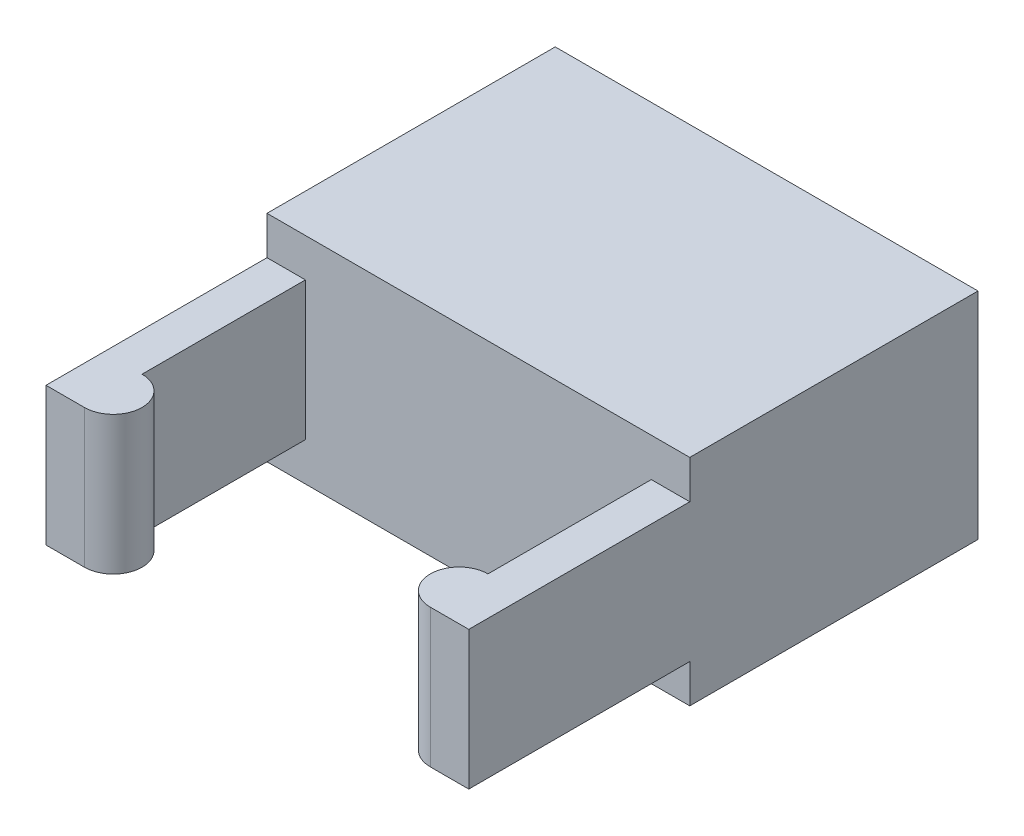
ISO-10303-21;
HEADER;
FILE_DESCRIPTION(('STEP AP214'),'2;1');
FILE_NAME('part.step','',(''),(''),'','','');
FILE_SCHEMA(('AUTOMOTIVE_DESIGN { 1 0 10303 214 1 1 1 1 }'));
ENDSEC;
DATA;
#1=APPLICATION_CONTEXT('core data for automotive mechanical design processes');
#2=APPLICATION_PROTOCOL_DEFINITION('international standard','automotive_design',2000,#1);
#3=PRODUCT_CONTEXT('',#1,'mechanical');
#4=PRODUCT('Part','Part','',(#3));
#5=PRODUCT_RELATED_PRODUCT_CATEGORY('part','',(#4));
#6=PRODUCT_DEFINITION_FORMATION('','',#4);
#7=PRODUCT_DEFINITION_CONTEXT('part definition',#1,'design');
#8=PRODUCT_DEFINITION('design','',#6,#7);
#9=PRODUCT_DEFINITION_SHAPE('','',#8);
#10=(LENGTH_UNIT() NAMED_UNIT(*) SI_UNIT(.MILLI.,.METRE.));
#11=(NAMED_UNIT(*) PLANE_ANGLE_UNIT() SI_UNIT($,.RADIAN.));
#12=(NAMED_UNIT(*) SI_UNIT($,.STERADIAN.) SOLID_ANGLE_UNIT());
#13=UNCERTAINTY_MEASURE_WITH_UNIT(LENGTH_MEASURE(1.E-05),#10,'distance_accuracy_value','');
#14=(GEOMETRIC_REPRESENTATION_CONTEXT(3) GLOBAL_UNCERTAINTY_ASSIGNED_CONTEXT((#13)) GLOBAL_UNIT_ASSIGNED_CONTEXT((#10,
#11,#12)) REPRESENTATION_CONTEXT('',''));
#15=CARTESIAN_POINT('',(0.,0.,0.));
#16=DIRECTION('',(0.,0.,1.));
#17=DIRECTION('',(1.,0.,0.));
#18=AXIS2_PLACEMENT_3D('',#15,#16,#17);
#19=CARTESIAN_POINT('',(0.,0.,15.));
#20=DIRECTION('',(0.,0.,1.));
#21=DIRECTION('',(1.,0.,0.));
#22=AXIS2_PLACEMENT_3D('',#19,#20,#21);
#23=PLANE('',#22);
#24=DIRECTION('',(1.,0.,0.));
#25=VECTOR('',#24,1.);
#26=CARTESIAN_POINT('',(0.,-3.6,15.));
#27=LINE('',#26,#25);
#28=CARTESIAN_POINT('',(-11.,-3.6,15.));
#29=VERTEX_POINT('',#28);
#30=CARTESIAN_POINT('',(-9.,-3.6,15.));
#31=VERTEX_POINT('',#30);
#32=EDGE_CURVE('E212',#29,#31,#27,.T.);
#33=ORIENTED_EDGE('',*,*,#32,.F.);
#34=DIRECTION('',(0.,1.,0.));
#35=VECTOR('',#34,1.);
#36=CARTESIAN_POINT('',(-11.,0.,15.));
#37=LINE('',#36,#35);
#38=CARTESIAN_POINT('',(-11.,-5.6,15.));
#39=VERTEX_POINT('',#38);
#40=EDGE_CURVE('E272',#39,#29,#37,.T.);
#41=ORIENTED_EDGE('',*,*,#40,.F.);
#42=DIRECTION('',(1.,0.,0.));
#43=VECTOR('',#42,1.);
#44=CARTESIAN_POINT('',(0.,-5.6,15.));
#45=LINE('',#44,#43);
#46=CARTESIAN_POINT('',(11.,-5.6,15.));
#47=VERTEX_POINT('',#46);
#48=EDGE_CURVE('E258',#39,#47,#45,.T.);
#49=ORIENTED_EDGE('',*,*,#48,.T.);
#50=DIRECTION('',(0.,1.,0.));
#51=VECTOR('',#50,1.);
#52=CARTESIAN_POINT('',(11.,0.,15.));
#53=LINE('',#52,#51);
#54=CARTESIAN_POINT('',(11.,-3.6,15.));
#55=VERTEX_POINT('',#54);
#56=EDGE_CURVE('E264',#47,#55,#53,.T.);
#57=ORIENTED_EDGE('',*,*,#56,.T.);
#58=DIRECTION('',(-1.,0.,0.));
#59=VECTOR('',#58,1.);
#60=CARTESIAN_POINT('',(0.,-3.6,15.));
#61=LINE('',#60,#59);
#62=CARTESIAN_POINT('',(9.,-3.6,15.));
#63=VERTEX_POINT('',#62);
#64=EDGE_CURVE('E70',#55,#63,#61,.T.);
#65=ORIENTED_EDGE('',*,*,#64,.T.);
#66=DIRECTION('',(0.,1.,0.));
#67=VECTOR('',#66,1.);
#68=CARTESIAN_POINT('',(9.,0.,15.));
#69=LINE('',#68,#67);
#70=CARTESIAN_POINT('',(9.,3.6,15.));
#71=VERTEX_POINT('',#70);
#72=EDGE_CURVE('E243',#63,#71,#69,.T.);
#73=ORIENTED_EDGE('',*,*,#72,.T.);
#74=DIRECTION('',(-1.,0.,0.));
#75=VECTOR('',#74,1.);
#76=CARTESIAN_POINT('',(0.,3.6,15.));
#77=LINE('',#76,#75);
#78=CARTESIAN_POINT('',(11.,3.6,15.));
#79=VERTEX_POINT('',#78);
#80=EDGE_CURVE('E240',#79,#71,#77,.T.);
#81=ORIENTED_EDGE('',*,*,#80,.F.);
#82=CARTESIAN_POINT('',(11.,5.6,15.));
#83=VERTEX_POINT('',#82);
#84=EDGE_CURVE('E262',#79,#83,#53,.T.);
#85=ORIENTED_EDGE('',*,*,#84,.T.);
#86=DIRECTION('',(1.,0.,0.));
#87=VECTOR('',#86,1.);
#88=CARTESIAN_POINT('',(0.,5.6,15.));
#89=LINE('',#88,#87);
#90=CARTESIAN_POINT('',(-11.,5.6,15.));
#91=VERTEX_POINT('',#90);
#92=EDGE_CURVE('E267',#91,#83,#89,.T.);
#93=ORIENTED_EDGE('',*,*,#92,.F.);
#94=CARTESIAN_POINT('',(-11.,3.6,15.));
#95=VERTEX_POINT('',#94);
#96=EDGE_CURVE('E271',#95,#91,#37,.T.);
#97=ORIENTED_EDGE('',*,*,#96,.F.);
#98=DIRECTION('',(1.,0.,0.));
#99=VECTOR('',#98,1.);
#100=CARTESIAN_POINT('',(0.,3.6,15.));
#101=LINE('',#100,#99);
#102=CARTESIAN_POINT('',(-9.,3.6,15.));
#103=VERTEX_POINT('',#102);
#104=EDGE_CURVE('E211',#95,#103,#101,.T.);
#105=ORIENTED_EDGE('',*,*,#104,.T.);
#106=DIRECTION('',(0.,1.,0.));
#107=VECTOR('',#106,1.);
#108=CARTESIAN_POINT('',(-9.,0.,15.));
#109=LINE('',#108,#107);
#110=EDGE_CURVE('E63',#31,#103,#109,.T.);
#111=ORIENTED_EDGE('',*,*,#110,.F.);
#112=EDGE_LOOP('',(#33,#41,#49,#57,#65,#73,#81,#85,#93,#97,#105,#111));
#113=FACE_BOUND('',#112,.T.);
#114=ADVANCED_FACE('F47',(#113),#23,.T.);
#115=CARTESIAN_POINT('',(0.,-5.6,15.));
#116=DIRECTION('',(0.,1.,0.));
#117=DIRECTION('',(0.,0.,1.));
#118=AXIS2_PLACEMENT_3D('',#115,#116,#117);
#119=PLANE('',#118);
#120=DIRECTION('',(1.,0.,0.));
#121=VECTOR('',#120,1.);
#122=CARTESIAN_POINT('',(0.,-5.6,0.));
#123=LINE('',#122,#121);
#124=CARTESIAN_POINT('',(-11.,-5.6,0.));
#125=VERTEX_POINT('',#124);
#126=CARTESIAN_POINT('',(11.,-5.6,0.));
#127=VERTEX_POINT('',#126);
#128=EDGE_CURVE('E235',#125,#127,#123,.T.);
#129=ORIENTED_EDGE('',*,*,#128,.T.);
#130=DIRECTION('',(0.,0.,-1.));
#131=VECTOR('',#130,1.);
#132=CARTESIAN_POINT('',(11.,-5.6,15.));
#133=LINE('',#132,#131);
#134=EDGE_CURVE('E11',#47,#127,#133,.T.);
#135=ORIENTED_EDGE('',*,*,#134,.F.);
#136=ORIENTED_EDGE('',*,*,#48,.F.);
#137=DIRECTION('',(0.,0.,-1.));
#138=VECTOR('',#137,1.);
#139=CARTESIAN_POINT('',(-11.,-5.6,15.));
#140=LINE('',#139,#138);
#141=EDGE_CURVE('E276',#39,#125,#140,.T.);
#142=ORIENTED_EDGE('',*,*,#141,.T.);
#143=EDGE_LOOP('',(#129,#135,#136,#142));
#144=FACE_BOUND('',#143,.T.);
#145=ADVANCED_FACE('F49',(#144),#119,.F.);
#146=CARTESIAN_POINT('',(11.,0.,15.));
#147=DIRECTION('',(-1.,0.,0.));
#148=DIRECTION('',(0.,0.,1.));
#149=AXIS2_PLACEMENT_3D('',#146,#147,#148);
#150=PLANE('',#149);
#151=DIRECTION('',(0.,1.,0.));
#152=VECTOR('',#151,1.);
#153=CARTESIAN_POINT('',(11.,0.,0.));
#154=LINE('',#153,#152);
#155=CARTESIAN_POINT('',(11.,5.6,0.));
#156=VERTEX_POINT('',#155);
#157=EDGE_CURVE('E280',#127,#156,#154,.T.);
#158=ORIENTED_EDGE('',*,*,#157,.T.);
#159=DIRECTION('',(0.,0.,-1.));
#160=VECTOR('',#159,1.);
#161=CARTESIAN_POINT('',(11.,5.6,15.));
#162=LINE('',#161,#160);
#163=EDGE_CURVE('E56',#83,#156,#162,.T.);
#164=ORIENTED_EDGE('',*,*,#163,.F.);
#165=ORIENTED_EDGE('',*,*,#84,.F.);
#166=DIRECTION('',(0.,0.,-1.));
#167=VECTOR('',#166,1.);
#168=CARTESIAN_POINT('',(11.,3.6,23.5));
#169=LINE('',#168,#167);
#170=CARTESIAN_POINT('',(11.,3.6,26.5));
#171=VERTEX_POINT('',#170);
#172=EDGE_CURVE('E251',#171,#79,#169,.T.);
#173=ORIENTED_EDGE('',*,*,#172,.F.);
#174=DIRECTION('',(0.,-1.,0.));
#175=VECTOR('',#174,1.);
#176=CARTESIAN_POINT('',(11.,8.20977222864645,26.5));
#177=LINE('',#176,#175);
#178=CARTESIAN_POINT('',(11.,-3.6,26.5));
#179=VERTEX_POINT('',#178);
#180=EDGE_CURVE('E176',#171,#179,#177,.T.);
#181=ORIENTED_EDGE('',*,*,#180,.T.);
#182=DIRECTION('',(0.,0.,-1.));
#183=VECTOR('',#182,1.);
#184=CARTESIAN_POINT('',(11.,-3.6,23.5));
#185=LINE('',#184,#183);
#186=EDGE_CURVE('E216',#179,#55,#185,.T.);
#187=ORIENTED_EDGE('',*,*,#186,.T.);
#188=ORIENTED_EDGE('',*,*,#56,.F.);
#189=ORIENTED_EDGE('',*,*,#134,.T.);
#190=EDGE_LOOP('',(#158,#164,#165,#173,#181,#187,#188,#189));
#191=FACE_BOUND('',#190,.T.);
#192=ADVANCED_FACE('F304',(#191),#150,.F.);
#193=CARTESIAN_POINT('',(0.,5.6,15.));
#194=DIRECTION('',(0.,1.,0.));
#195=DIRECTION('',(0.,0.,1.));
#196=AXIS2_PLACEMENT_3D('',#193,#194,#195);
#197=PLANE('',#196);
#198=DIRECTION('',(1.,0.,0.));
#199=VECTOR('',#198,1.);
#200=CARTESIAN_POINT('',(0.,5.6,0.));
#201=LINE('',#200,#199);
#202=CARTESIAN_POINT('',(-11.,5.6,0.));
#203=VERTEX_POINT('',#202);
#204=EDGE_CURVE('E284',#203,#156,#201,.T.);
#205=ORIENTED_EDGE('',*,*,#204,.F.);
#206=DIRECTION('',(0.,0.,-1.));
#207=VECTOR('',#206,1.);
#208=CARTESIAN_POINT('',(-11.,5.6,15.));
#209=LINE('',#208,#207);
#210=EDGE_CURVE('E293',#91,#203,#209,.T.);
#211=ORIENTED_EDGE('',*,*,#210,.F.);
#212=ORIENTED_EDGE('',*,*,#92,.T.);
#213=ORIENTED_EDGE('',*,*,#163,.T.);
#214=EDGE_LOOP('',(#205,#211,#212,#213));
#215=FACE_BOUND('',#214,.T.);
#216=ADVANCED_FACE('F299',(#215),#197,.T.);
#217=CARTESIAN_POINT('',(-11.,0.,15.));
#218=DIRECTION('',(-1.,0.,0.));
#219=DIRECTION('',(0.,0.,1.));
#220=AXIS2_PLACEMENT_3D('',#217,#218,#219);
#221=PLANE('',#220);
#222=DIRECTION('',(0.,1.,0.));
#223=VECTOR('',#222,1.);
#224=CARTESIAN_POINT('',(-11.,0.,0.));
#225=LINE('',#224,#223);
#226=EDGE_CURVE('E263',#125,#203,#225,.T.);
#227=ORIENTED_EDGE('',*,*,#226,.F.);
#228=ORIENTED_EDGE('',*,*,#141,.F.);
#229=ORIENTED_EDGE('',*,*,#40,.T.);
#230=DIRECTION('',(0.,0.,-1.));
#231=VECTOR('',#230,1.);
#232=CARTESIAN_POINT('',(-11.,-3.6,23.5));
#233=LINE('',#232,#231);
#234=CARTESIAN_POINT('',(-11.,-3.6,26.5));
#235=VERTEX_POINT('',#234);
#236=EDGE_CURVE('E210',#235,#29,#233,.T.);
#237=ORIENTED_EDGE('',*,*,#236,.F.);
#238=DIRECTION('',(0.,-1.,0.));
#239=VECTOR('',#238,1.);
#240=CARTESIAN_POINT('',(-11.,8.20977222864645,26.5));
#241=LINE('',#240,#239);
#242=CARTESIAN_POINT('',(-11.,3.6,26.5));
#243=VERTEX_POINT('',#242);
#244=EDGE_CURVE('E185',#243,#235,#241,.T.);
#245=ORIENTED_EDGE('',*,*,#244,.F.);
#246=DIRECTION('',(0.,0.,-1.));
#247=VECTOR('',#246,1.);
#248=CARTESIAN_POINT('',(-11.,3.6,23.5));
#249=LINE('',#248,#247);
#250=EDGE_CURVE('E224',#243,#95,#249,.T.);
#251=ORIENTED_EDGE('',*,*,#250,.T.);
#252=ORIENTED_EDGE('',*,*,#96,.T.);
#253=ORIENTED_EDGE('',*,*,#210,.T.);
#254=EDGE_LOOP('',(#227,#228,#229,#237,#245,#251,#252,#253));
#255=FACE_BOUND('',#254,.T.);
#256=ADVANCED_FACE('F311',(#255),#221,.T.);
#257=CARTESIAN_POINT('',(0.,0.,0.));
#258=DIRECTION('',(0.,0.,1.));
#259=DIRECTION('',(1.,0.,0.));
#260=AXIS2_PLACEMENT_3D('',#257,#258,#259);
#261=PLANE('',#260);
#262=ORIENTED_EDGE('',*,*,#128,.F.);
#263=ORIENTED_EDGE('',*,*,#226,.T.);
#264=ORIENTED_EDGE('',*,*,#204,.T.);
#265=ORIENTED_EDGE('',*,*,#157,.F.);
#266=EDGE_LOOP('',(#262,#263,#264,#265));
#267=FACE_BOUND('',#266,.T.);
#268=ADVANCED_FACE('F308',(#267),#261,.F.);
#269=CARTESIAN_POINT('',(0.,-3.6,23.5));
#270=DIRECTION('',(0.,-1.,0.));
#271=DIRECTION('',(1.,0.,0.));
#272=AXIS2_PLACEMENT_3D('',#269,#270,#271);
#273=PLANE('',#272);
#274=ORIENTED_EDGE('',*,*,#64,.F.);
#275=ORIENTED_EDGE('',*,*,#186,.F.);
#276=DIRECTION('',(-1.,0.,0.));
#277=VECTOR('',#276,1.);
#278=CARTESIAN_POINT('',(0.,-3.6,26.5));
#279=LINE('',#278,#277);
#280=CARTESIAN_POINT('',(9.,-3.6,26.5));
#281=VERTEX_POINT('',#280);
#282=EDGE_CURVE('E162',#179,#281,#279,.T.);
#283=ORIENTED_EDGE('',*,*,#282,.T.);
#284=CARTESIAN_POINT('',(9.,-3.6,25.));
#285=DIRECTION('',(0.,1.,0.));
#286=DIRECTION('',(-1.,0.,0.));
#287=AXIS2_PLACEMENT_3D('',#284,#285,#286);
#288=CIRCLE('',#287,1.5);
#289=CARTESIAN_POINT('',(9.,-3.6,23.5));
#290=VERTEX_POINT('',#289);
#291=EDGE_CURVE('E168',#290,#281,#288,.T.);
#292=ORIENTED_EDGE('',*,*,#291,.F.);
#293=DIRECTION('',(0.,0.,-1.));
#294=VECTOR('',#293,1.);
#295=CARTESIAN_POINT('',(9.,-3.6,23.5));
#296=LINE('',#295,#294);
#297=EDGE_CURVE('E239',#290,#63,#296,.T.);
#298=ORIENTED_EDGE('',*,*,#297,.T.);
#299=EDGE_LOOP('',(#274,#275,#283,#292,#298));
#300=FACE_BOUND('',#299,.T.);
#301=ADVANCED_FACE('F317',(#300),#273,.T.);
#302=CARTESIAN_POINT('',(0.,3.6,23.5));
#303=DIRECTION('',(0.,-1.,0.));
#304=DIRECTION('',(1.,0.,0.));
#305=AXIS2_PLACEMENT_3D('',#302,#303,#304);
#306=PLANE('',#305);
#307=ORIENTED_EDGE('',*,*,#80,.T.);
#308=DIRECTION('',(0.,0.,-1.));
#309=VECTOR('',#308,1.);
#310=CARTESIAN_POINT('',(9.,3.6,23.5));
#311=LINE('',#310,#309);
#312=CARTESIAN_POINT('',(9.,3.6,23.5));
#313=VERTEX_POINT('',#312);
#314=EDGE_CURVE('E157',#313,#71,#311,.T.);
#315=ORIENTED_EDGE('',*,*,#314,.F.);
#316=CARTESIAN_POINT('',(9.,3.6,25.));
#317=DIRECTION('',(0.,1.,0.));
#318=DIRECTION('',(0.,0.,1.));
#319=AXIS2_PLACEMENT_3D('',#316,#317,#318);
#320=CIRCLE('',#319,1.5);
#321=CARTESIAN_POINT('',(9.,3.6,26.5));
#322=VERTEX_POINT('',#321);
#323=EDGE_CURVE('E148',#313,#322,#320,.T.);
#324=ORIENTED_EDGE('',*,*,#323,.T.);
#325=DIRECTION('',(-1.,0.,0.));
#326=VECTOR('',#325,1.);
#327=CARTESIAN_POINT('',(0.,3.6,26.5));
#328=LINE('',#327,#326);
#329=EDGE_CURVE('E154',#171,#322,#328,.T.);
#330=ORIENTED_EDGE('',*,*,#329,.F.);
#331=ORIENTED_EDGE('',*,*,#172,.T.);
#332=EDGE_LOOP('',(#307,#315,#324,#330,#331));
#333=FACE_BOUND('',#332,.T.);
#334=ADVANCED_FACE('F151',(#333),#306,.F.);
#335=CARTESIAN_POINT('',(9.,0.,23.5));
#336=DIRECTION('',(-1.,0.,0.));
#337=DIRECTION('',(0.,-1.,0.));
#338=AXIS2_PLACEMENT_3D('',#335,#336,#337);
#339=PLANE('',#338);
#340=ORIENTED_EDGE('',*,*,#72,.F.);
#341=ORIENTED_EDGE('',*,*,#297,.F.);
#342=DIRECTION('',(0.,1.,0.));
#343=VECTOR('',#342,1.);
#344=CARTESIAN_POINT('',(9.,0.,23.5));
#345=LINE('',#344,#343);
#346=EDGE_CURVE('E236',#290,#313,#345,.T.);
#347=ORIENTED_EDGE('',*,*,#346,.T.);
#348=ORIENTED_EDGE('',*,*,#314,.T.);
#349=EDGE_LOOP('',(#340,#341,#347,#348));
#350=FACE_BOUND('',#349,.T.);
#351=ADVANCED_FACE('F320',(#350),#339,.T.);
#352=CARTESIAN_POINT('',(0.,-3.6,23.5));
#353=DIRECTION('',(0.,1.,0.));
#354=DIRECTION('',(-1.,0.,0.));
#355=AXIS2_PLACEMENT_3D('',#352,#353,#354);
#356=PLANE('',#355);
#357=ORIENTED_EDGE('',*,*,#32,.T.);
#358=DIRECTION('',(0.,0.,-1.));
#359=VECTOR('',#358,1.);
#360=CARTESIAN_POINT('',(-9.,-3.6,23.5));
#361=LINE('',#360,#359);
#362=CARTESIAN_POINT('',(-9.,-3.6,23.5));
#363=VERTEX_POINT('',#362);
#364=EDGE_CURVE('E232',#363,#31,#361,.T.);
#365=ORIENTED_EDGE('',*,*,#364,.F.);
#366=CARTESIAN_POINT('',(-9.,-3.6,25.));
#367=DIRECTION('',(0.,1.,0.));
#368=DIRECTION('',(-1.,0.,0.));
#369=AXIS2_PLACEMENT_3D('',#366,#367,#368);
#370=CIRCLE('',#369,1.5);
#371=CARTESIAN_POINT('',(-9.,-3.6,26.5));
#372=VERTEX_POINT('',#371);
#373=EDGE_CURVE('E191',#372,#363,#370,.T.);
#374=ORIENTED_EDGE('',*,*,#373,.F.);
#375=DIRECTION('',(1.,0.,0.));
#376=VECTOR('',#375,1.);
#377=CARTESIAN_POINT('',(0.,-3.6,26.5));
#378=LINE('',#377,#376);
#379=EDGE_CURVE('E186',#235,#372,#378,.T.);
#380=ORIENTED_EDGE('',*,*,#379,.F.);
#381=ORIENTED_EDGE('',*,*,#236,.T.);
#382=EDGE_LOOP('',(#357,#365,#374,#380,#381));
#383=FACE_BOUND('',#382,.T.);
#384=ADVANCED_FACE('F322',(#383),#356,.F.);
#385=CARTESIAN_POINT('',(-9.,0.,23.5));
#386=DIRECTION('',(-1.,0.,0.));
#387=DIRECTION('',(0.,0.,1.));
#388=AXIS2_PLACEMENT_3D('',#385,#386,#387);
#389=PLANE('',#388);
#390=ORIENTED_EDGE('',*,*,#110,.T.);
#391=DIRECTION('',(0.,0.,-1.));
#392=VECTOR('',#391,1.);
#393=CARTESIAN_POINT('',(-9.,3.6,23.5));
#394=LINE('',#393,#392);
#395=CARTESIAN_POINT('',(-9.,3.6,23.5));
#396=VERTEX_POINT('',#395);
#397=EDGE_CURVE('E228',#396,#103,#394,.T.);
#398=ORIENTED_EDGE('',*,*,#397,.F.);
#399=DIRECTION('',(0.,1.,0.));
#400=VECTOR('',#399,1.);
#401=CARTESIAN_POINT('',(-9.,0.,23.5));
#402=LINE('',#401,#400);
#403=EDGE_CURVE('E206',#363,#396,#402,.T.);
#404=ORIENTED_EDGE('',*,*,#403,.F.);
#405=ORIENTED_EDGE('',*,*,#364,.T.);
#406=EDGE_LOOP('',(#390,#398,#404,#405));
#407=FACE_BOUND('',#406,.T.);
#408=ADVANCED_FACE('F329',(#407),#389,.F.);
#409=CARTESIAN_POINT('',(0.,3.6,23.5));
#410=DIRECTION('',(0.,1.,0.));
#411=DIRECTION('',(0.,0.,1.));
#412=AXIS2_PLACEMENT_3D('',#409,#410,#411);
#413=PLANE('',#412);
#414=ORIENTED_EDGE('',*,*,#104,.F.);
#415=ORIENTED_EDGE('',*,*,#250,.F.);
#416=DIRECTION('',(1.,0.,0.));
#417=VECTOR('',#416,1.);
#418=CARTESIAN_POINT('',(0.,3.6,26.5));
#419=LINE('',#418,#417);
#420=CARTESIAN_POINT('',(-9.,3.6,26.5));
#421=VERTEX_POINT('',#420);
#422=EDGE_CURVE('E194',#243,#421,#419,.T.);
#423=ORIENTED_EDGE('',*,*,#422,.T.);
#424=CARTESIAN_POINT('',(-9.,3.6,25.));
#425=DIRECTION('',(0.,1.,0.));
#426=DIRECTION('',(0.,0.,1.));
#427=AXIS2_PLACEMENT_3D('',#424,#425,#426);
#428=CIRCLE('',#427,1.5);
#429=EDGE_CURVE('E198',#421,#396,#428,.T.);
#430=ORIENTED_EDGE('',*,*,#429,.T.);
#431=ORIENTED_EDGE('',*,*,#397,.T.);
#432=EDGE_LOOP('',(#414,#415,#423,#430,#431));
#433=FACE_BOUND('',#432,.T.);
#434=ADVANCED_FACE('F393',(#433),#413,.T.);
#435=CARTESIAN_POINT('',(0.,8.20977222864644,26.5));
#436=DIRECTION('',(0.,0.,-1.));
#437=DIRECTION('',(-1.,0.,0.));
#438=AXIS2_PLACEMENT_3D('',#435,#436,#437);
#439=PLANE('',#438);
#440=ORIENTED_EDGE('',*,*,#422,.F.);
#441=ORIENTED_EDGE('',*,*,#244,.T.);
#442=ORIENTED_EDGE('',*,*,#379,.T.);
#443=DIRECTION('',(0.,-1.,0.));
#444=VECTOR('',#443,1.);
#445=CARTESIAN_POINT('',(-9.,8.20977222864645,26.5));
#446=LINE('',#445,#444);
#447=EDGE_CURVE('E190',#421,#372,#446,.T.);
#448=ORIENTED_EDGE('',*,*,#447,.F.);
#449=EDGE_LOOP('',(#440,#441,#442,#448));
#450=FACE_BOUND('',#449,.T.);
#451=ADVANCED_FACE('F390',(#450),#439,.F.);
#452=CARTESIAN_POINT('',(-9.,8.20977222864645,25.));
#453=DIRECTION('',(0.,-1.,0.));
#454=DIRECTION('',(0.,0.,-1.));
#455=AXIS2_PLACEMENT_3D('',#452,#453,#454);
#456=CYLINDRICAL_SURFACE('',#455,1.5);
#457=ORIENTED_EDGE('',*,*,#429,.F.);
#458=ORIENTED_EDGE('',*,*,#447,.T.);
#459=ORIENTED_EDGE('',*,*,#373,.T.);
#460=ORIENTED_EDGE('',*,*,#403,.T.);
#461=EDGE_LOOP('',(#457,#458,#459,#460));
#462=FACE_BOUND('',#461,.T.);
#463=ADVANCED_FACE('F356',(#462),#456,.T.);
#464=CARTESIAN_POINT('',(0.,8.20977222864645,26.5));
#465=DIRECTION('',(0.,0.,1.));
#466=DIRECTION('',(1.,0.,0.));
#467=AXIS2_PLACEMENT_3D('',#464,#465,#466);
#468=PLANE('',#467);
#469=ORIENTED_EDGE('',*,*,#180,.F.);
#470=ORIENTED_EDGE('',*,*,#329,.T.);
#471=DIRECTION('',(0.,-1.,0.));
#472=VECTOR('',#471,1.);
#473=CARTESIAN_POINT('',(9.,8.20977222864645,26.5));
#474=LINE('',#473,#472);
#475=EDGE_CURVE('E165',#322,#281,#474,.T.);
#476=ORIENTED_EDGE('',*,*,#475,.T.);
#477=ORIENTED_EDGE('',*,*,#282,.F.);
#478=EDGE_LOOP('',(#469,#470,#476,#477));
#479=FACE_BOUND('',#478,.T.);
#480=ADVANCED_FACE('F174',(#479),#468,.T.);
#481=CARTESIAN_POINT('',(9.,8.20977222864645,25.));
#482=DIRECTION('',(0.,-1.,0.));
#483=DIRECTION('',(0.,0.,-1.));
#484=AXIS2_PLACEMENT_3D('',#481,#482,#483);
#485=CYLINDRICAL_SURFACE('',#484,1.5);
#486=ORIENTED_EDGE('',*,*,#323,.F.);
#487=ORIENTED_EDGE('',*,*,#346,.F.);
#488=ORIENTED_EDGE('',*,*,#291,.T.);
#489=ORIENTED_EDGE('',*,*,#475,.F.);
#490=EDGE_LOOP('',(#486,#487,#488,#489));
#491=FACE_BOUND('',#490,.T.);
#492=ADVANCED_FACE('F166',(#491),#485,.T.);
#493=CLOSED_SHELL('',(#114,#145,#192,#216,#256,#268,#301,#334,#351,#384,#408,#434,#451,#463,
#480,#492));
#494=MANIFOLD_SOLID_BREP('B2',#493);
#495=ADVANCED_BREP_SHAPE_REPRESENTATION('',(#18,#494),#14);
#496=SHAPE_DEFINITION_REPRESENTATION(#9,#495);
ENDSEC;
END-ISO-10303-21;
